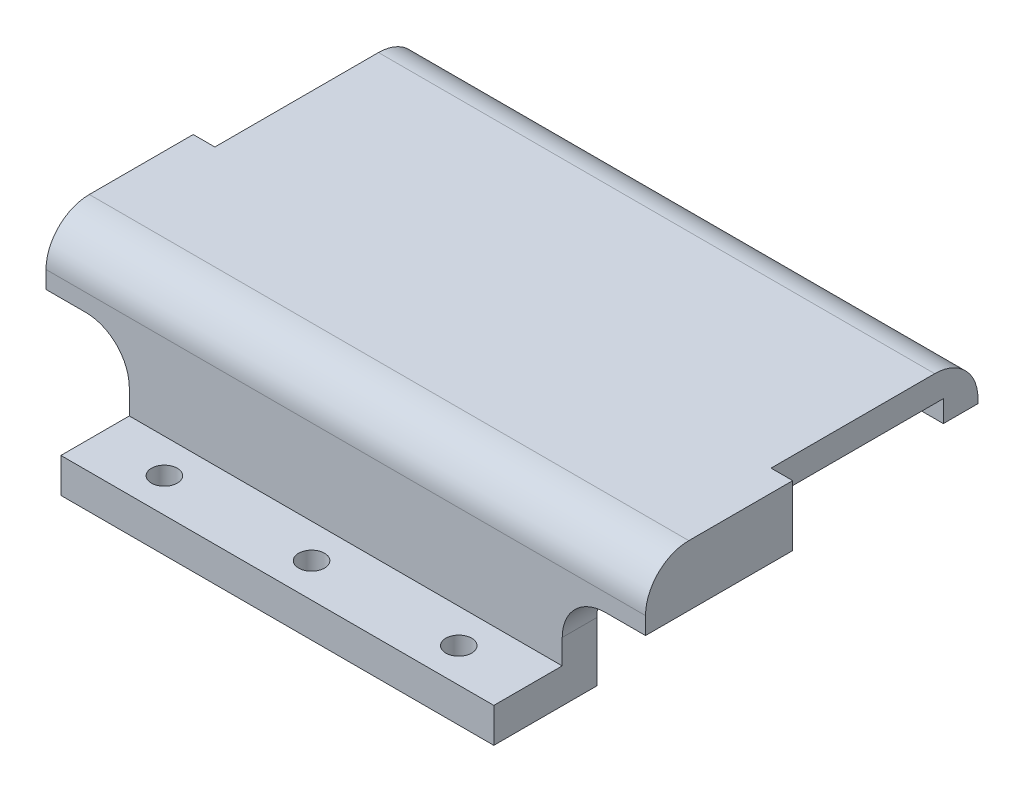
ISO-10303-21;
HEADER;
FILE_DESCRIPTION(('STEP AP214'),'2;1');
FILE_NAME('part.step','',(''),(''),'','','');
FILE_SCHEMA(('AUTOMOTIVE_DESIGN { 1 0 10303 214 1 1 1 1 }'));
ENDSEC;
DATA;
#1=APPLICATION_CONTEXT('core data for automotive mechanical design processes');
#2=APPLICATION_PROTOCOL_DEFINITION('international standard','automotive_design',2000,#1);
#3=PRODUCT_CONTEXT('',#1,'mechanical');
#4=PRODUCT('Part','Part','',(#3));
#5=PRODUCT_RELATED_PRODUCT_CATEGORY('part','',(#4));
#6=PRODUCT_DEFINITION_FORMATION('','',#4);
#7=PRODUCT_DEFINITION_CONTEXT('part definition',#1,'design');
#8=PRODUCT_DEFINITION('design','',#6,#7);
#9=PRODUCT_DEFINITION_SHAPE('','',#8);
#10=(LENGTH_UNIT() NAMED_UNIT(*) SI_UNIT(.MILLI.,.METRE.));
#11=(NAMED_UNIT(*) PLANE_ANGLE_UNIT() SI_UNIT($,.RADIAN.));
#12=(NAMED_UNIT(*) SI_UNIT($,.STERADIAN.) SOLID_ANGLE_UNIT());
#13=UNCERTAINTY_MEASURE_WITH_UNIT(LENGTH_MEASURE(1.E-05),#10,'distance_accuracy_value','');
#14=(GEOMETRIC_REPRESENTATION_CONTEXT(3) GLOBAL_UNCERTAINTY_ASSIGNED_CONTEXT((#13)) GLOBAL_UNIT_ASSIGNED_CONTEXT((#10,
#11,#12)) REPRESENTATION_CONTEXT('',''));
#15=CARTESIAN_POINT('',(0.,0.,0.));
#16=DIRECTION('',(0.,0.,1.));
#17=DIRECTION('',(1.,0.,0.));
#18=AXIS2_PLACEMENT_3D('',#15,#16,#17);
#19=CARTESIAN_POINT('',(-31.75,-15.0368,36.0045));
#20=DIRECTION('',(0.,-1.,0.));
#21=DIRECTION('',(0.,0.,-1.));
#22=AXIS2_PLACEMENT_3D('',#19,#20,#21);
#23=PLANE('',#22);
#24=CARTESIAN_POINT('',(-21.59,-15.0368,30.988));
#25=DIRECTION('',(0.,1.,0.));
#26=DIRECTION('',(0.,0.,1.));
#27=AXIS2_PLACEMENT_3D('',#24,#25,#26);
#28=CIRCLE('',#27,1.89865);
#29=CARTESIAN_POINT('',(-21.59,-15.0368,32.88665));
#30=VERTEX_POINT('',#29);
#31=EDGE_CURVE('E528',#30,#30,#28,.T.);
#32=ORIENTED_EDGE('',*,*,#31,.F.);
#33=EDGE_LOOP('',(#32));
#34=FACE_BOUND('',#33,.T.);
#35=CARTESIAN_POINT('',(21.59,-15.0368,30.988));
#36=DIRECTION('',(0.,1.,0.));
#37=DIRECTION('',(0.,0.,1.));
#38=AXIS2_PLACEMENT_3D('',#35,#36,#37);
#39=CIRCLE('',#38,1.89865);
#40=CARTESIAN_POINT('',(21.59,-15.0368,32.88665));
#41=VERTEX_POINT('',#40);
#42=EDGE_CURVE('E516',#41,#41,#39,.T.);
#43=ORIENTED_EDGE('',*,*,#42,.F.);
#44=EDGE_LOOP('',(#43));
#45=FACE_BOUND('',#44,.T.);
#46=DIRECTION('',(-1.,0.,0.));
#47=VECTOR('',#46,1.);
#48=CARTESIAN_POINT('',(-31.75,-15.0368,25.9715));
#49=LINE('',#48,#47);
#50=CARTESIAN_POINT('',(31.75,-15.0368,25.9715));
#51=VERTEX_POINT('',#50);
#52=CARTESIAN_POINT('',(-31.75,-15.0368,25.9715));
#53=VERTEX_POINT('',#52);
#54=EDGE_CURVE('E360',#51,#53,#49,.T.);
#55=ORIENTED_EDGE('',*,*,#54,.T.);
#56=DIRECTION('',(0.,0.,-1.));
#57=VECTOR('',#56,1.);
#58=CARTESIAN_POINT('',(-31.75,-15.0368,36.0045));
#59=LINE('',#58,#57);
#60=CARTESIAN_POINT('',(-31.75,-15.0368,36.0045));
#61=VERTEX_POINT('',#60);
#62=EDGE_CURVE('E241',#61,#53,#59,.T.);
#63=ORIENTED_EDGE('',*,*,#62,.F.);
#64=DIRECTION('',(-1.,0.,0.));
#65=VECTOR('',#64,1.);
#66=CARTESIAN_POINT('',(-31.75,-15.0368,36.0045));
#67=LINE('',#66,#65);
#68=CARTESIAN_POINT('',(31.75,-15.0368,36.0045));
#69=VERTEX_POINT('',#68);
#70=EDGE_CURVE('E375',#69,#61,#67,.T.);
#71=ORIENTED_EDGE('',*,*,#70,.F.);
#72=DIRECTION('',(0.,0.,-1.));
#73=VECTOR('',#72,1.);
#74=CARTESIAN_POINT('',(31.75,-15.0368,36.0045));
#75=LINE('',#74,#73);
#76=EDGE_CURVE('E236',#69,#51,#75,.T.);
#77=ORIENTED_EDGE('',*,*,#76,.T.);
#78=EDGE_LOOP('',(#55,#63,#71,#77));
#79=FACE_BOUND('',#78,.T.);
#80=CARTESIAN_POINT('',(0.,-15.0368,30.988));
#81=DIRECTION('',(0.,1.,0.));
#82=DIRECTION('',(0.,0.,1.));
#83=AXIS2_PLACEMENT_3D('',#80,#81,#82);
#84=CIRCLE('',#83,1.89865);
#85=CARTESIAN_POINT('',(0.,-15.0368,32.88665));
#86=VERTEX_POINT('',#85);
#87=EDGE_CURVE('E522',#86,#86,#84,.T.);
#88=ORIENTED_EDGE('',*,*,#87,.F.);
#89=EDGE_LOOP('',(#88));
#90=FACE_BOUND('',#89,.T.);
#91=ADVANCED_FACE('F33',(#34,#45,#79,#90),#23,.F.);
#92=CARTESIAN_POINT('',(0.,0.,0.));
#93=DIRECTION('',(0.,-1.,0.));
#94=DIRECTION('',(0.,0.,-1.));
#95=AXIS2_PLACEMENT_3D('',#92,#93,#94);
#96=PLANE('',#95);
#97=DIRECTION('',(1.,0.,0.));
#98=VECTOR('',#97,1.);
#99=CARTESIAN_POINT('',(-31.75,0.,20.8915));
#100=LINE('',#99,#98);
#101=CARTESIAN_POINT('',(0.634999999999997,0.,20.8915));
#102=VERTEX_POINT('',#101);
#103=CARTESIAN_POINT('',(40.7924,0.,20.8915));
#104=VERTEX_POINT('',#103);
#105=EDGE_CURVE('E252',#102,#104,#100,.T.);
#106=ORIENTED_EDGE('',*,*,#105,.F.);
#107=DIRECTION('',(0.,0.,1.));
#108=VECTOR('',#107,1.);
#109=CARTESIAN_POINT('',(0.634999999999997,0.,20.8915));
#110=LINE('',#109,#108);
#111=CARTESIAN_POINT('',(0.635000000000005,0.,-20.8915));
#112=VERTEX_POINT('',#111);
#113=EDGE_CURVE('E217',#112,#102,#110,.T.);
#114=ORIENTED_EDGE('',*,*,#113,.F.);
#115=DIRECTION('',(-1.,0.,0.));
#116=VECTOR('',#115,1.);
#117=CARTESIAN_POINT('',(-40.7924,0.,-20.8915));
#118=LINE('',#117,#116);
#119=CARTESIAN_POINT('',(40.7924,0.,-20.8915));
#120=VERTEX_POINT('',#119);
#121=EDGE_CURVE('E235',#120,#112,#118,.T.);
#122=ORIENTED_EDGE('',*,*,#121,.F.);
#123=DIRECTION('',(0.,0.,-1.));
#124=VECTOR('',#123,1.);
#125=CARTESIAN_POINT('',(40.7924,0.,25.9715));
#126=LINE('',#125,#124);
#127=CARTESIAN_POINT('',(40.7924,0.,4.38149999999999));
#128=VERTEX_POINT('',#127);
#129=EDGE_CURVE('E274',#128,#120,#126,.T.);
#130=ORIENTED_EDGE('',*,*,#129,.F.);
#131=EDGE_CURVE('E281',#104,#128,#126,.T.);
#132=ORIENTED_EDGE('',*,*,#131,.F.);
#133=EDGE_LOOP('',(#106,#114,#122,#130,#132));
#134=FACE_BOUND('',#133,.T.);
#135=ADVANCED_FACE('F536',(#134),#96,.T.);
#136=CARTESIAN_POINT('',(-0.634999999999995,0.,-20.8915));
#137=VERTEX_POINT('',#136);
#138=CARTESIAN_POINT('',(-40.7924,0.,-20.8915));
#139=VERTEX_POINT('',#138);
#140=EDGE_CURVE('E224',#137,#139,#118,.T.);
#141=ORIENTED_EDGE('',*,*,#140,.F.);
#142=DIRECTION('',(0.,0.,-1.));
#143=VECTOR('',#142,1.);
#144=CARTESIAN_POINT('',(-0.634999999999997,0.,20.8915));
#145=LINE('',#144,#143);
#146=CARTESIAN_POINT('',(-0.634999999999997,0.,20.8915));
#147=VERTEX_POINT('',#146);
#148=EDGE_CURVE('E210',#147,#137,#145,.T.);
#149=ORIENTED_EDGE('',*,*,#148,.F.);
#150=CARTESIAN_POINT('',(-40.7924,0.,20.8915));
#151=VERTEX_POINT('',#150);
#152=EDGE_CURVE('E257',#151,#147,#100,.T.);
#153=ORIENTED_EDGE('',*,*,#152,.F.);
#154=DIRECTION('',(0.,0.,1.));
#155=VECTOR('',#154,1.);
#156=CARTESIAN_POINT('',(-40.7924,0.,25.9715));
#157=LINE('',#156,#155);
#158=CARTESIAN_POINT('',(-40.7924,0.,4.3815));
#159=VERTEX_POINT('',#158);
#160=EDGE_CURVE('E283',#159,#151,#157,.T.);
#161=ORIENTED_EDGE('',*,*,#160,.F.);
#162=EDGE_CURVE('E234',#139,#159,#157,.T.);
#163=ORIENTED_EDGE('',*,*,#162,.F.);
#164=EDGE_LOOP('',(#141,#149,#153,#161,#163));
#165=FACE_BOUND('',#164,.T.);
#166=ADVANCED_FACE('F231',(#165),#96,.T.);
#167=CARTESIAN_POINT('',(-31.75,-20.1168,20.8915));
#168=DIRECTION('',(0.,0.,1.));
#169=DIRECTION('',(1.,0.,0.));
#170=AXIS2_PLACEMENT_3D('',#167,#168,#169);
#171=PLANE('',#170);
#172=DIRECTION('',(0.,1.,0.));
#173=VECTOR('',#172,1.);
#174=CARTESIAN_POINT('',(0.634999999999997,-44.9772964560561,20.8915));
#175=LINE('',#174,#173);
#176=CARTESIAN_POINT('',(0.634999999999997,-3.17500000000001,20.8915));
#177=VERTEX_POINT('',#176);
#178=EDGE_CURVE('E400',#177,#102,#175,.T.);
#179=ORIENTED_EDGE('',*,*,#178,.T.);
#180=ORIENTED_EDGE('',*,*,#105,.T.);
#181=DIRECTION('',(0.,-1.,0.));
#182=VECTOR('',#181,1.);
#183=CARTESIAN_POINT('',(40.7924,-5.08,20.8915));
#184=LINE('',#183,#182);
#185=CARTESIAN_POINT('',(40.7924,-5.08,20.8915));
#186=VERTEX_POINT('',#185);
#187=EDGE_CURVE('E417',#104,#186,#184,.T.);
#188=ORIENTED_EDGE('',*,*,#187,.T.);
#189=DIRECTION('',(-1.,0.,0.));
#190=VECTOR('',#189,1.);
#191=CARTESIAN_POINT('',(40.7924,-5.08,20.8915));
#192=LINE('',#191,#190);
#193=CARTESIAN_POINT('',(38.1,-5.08,20.8915));
#194=VERTEX_POINT('',#193);
#195=EDGE_CURVE('E414',#186,#194,#192,.T.);
#196=ORIENTED_EDGE('',*,*,#195,.T.);
#197=CARTESIAN_POINT('',(38.1,-11.43,20.8915));
#198=DIRECTION('',(0.,0.,1.));
#199=DIRECTION('',(1.,0.,0.));
#200=AXIS2_PLACEMENT_3D('',#197,#198,#199);
#201=CIRCLE('',#200,6.35);
#202=CARTESIAN_POINT('',(31.75,-11.43,20.8915));
#203=VERTEX_POINT('',#202);
#204=EDGE_CURVE('E311',#194,#203,#201,.T.);
#205=ORIENTED_EDGE('',*,*,#204,.T.);
#206=DIRECTION('',(0.,1.,0.));
#207=VECTOR('',#206,1.);
#208=CARTESIAN_POINT('',(31.75,-20.1168,20.8915));
#209=LINE('',#208,#207);
#210=CARTESIAN_POINT('',(31.75,-20.1168,20.8915));
#211=VERTEX_POINT('',#210);
#212=EDGE_CURVE('E268',#211,#203,#209,.T.);
#213=ORIENTED_EDGE('',*,*,#212,.F.);
#214=DIRECTION('',(1.,0.,0.));
#215=VECTOR('',#214,1.);
#216=CARTESIAN_POINT('',(-31.75,-20.1168,20.8915));
#217=LINE('',#216,#215);
#218=CARTESIAN_POINT('',(-31.75,-20.1168,20.8915));
#219=VERTEX_POINT('',#218);
#220=EDGE_CURVE('E256',#219,#211,#217,.T.);
#221=ORIENTED_EDGE('',*,*,#220,.F.);
#222=DIRECTION('',(0.,1.,0.));
#223=VECTOR('',#222,1.);
#224=CARTESIAN_POINT('',(-31.75,-20.1168,20.8915));
#225=LINE('',#224,#223);
#226=CARTESIAN_POINT('',(-31.75,-11.43,20.8915));
#227=VERTEX_POINT('',#226);
#228=EDGE_CURVE('E271',#219,#227,#225,.T.);
#229=ORIENTED_EDGE('',*,*,#228,.T.);
#230=CARTESIAN_POINT('',(-38.1,-11.43,20.8915));
#231=DIRECTION('',(0.,0.,1.));
#232=DIRECTION('',(1.,0.,0.));
#233=AXIS2_PLACEMENT_3D('',#230,#231,#232);
#234=CIRCLE('',#233,6.35);
#235=CARTESIAN_POINT('',(-38.1,-5.08,20.8915));
#236=VERTEX_POINT('',#235);
#237=EDGE_CURVE('E315',#227,#236,#234,.T.);
#238=ORIENTED_EDGE('',*,*,#237,.T.);
#239=DIRECTION('',(-1.,0.,0.));
#240=VECTOR('',#239,1.);
#241=CARTESIAN_POINT('',(-40.7924,-5.08,20.8915));
#242=LINE('',#241,#240);
#243=CARTESIAN_POINT('',(-40.7924,-5.08,20.8915));
#244=VERTEX_POINT('',#243);
#245=EDGE_CURVE('E411',#236,#244,#242,.T.);
#246=ORIENTED_EDGE('',*,*,#245,.T.);
#247=DIRECTION('',(0.,1.,0.));
#248=VECTOR('',#247,1.);
#249=CARTESIAN_POINT('',(-40.7924,-5.08,20.8915));
#250=LINE('',#249,#248);
#251=EDGE_CURVE('E408',#244,#151,#250,.T.);
#252=ORIENTED_EDGE('',*,*,#251,.T.);
#253=ORIENTED_EDGE('',*,*,#152,.T.);
#254=DIRECTION('',(0.,1.,0.));
#255=VECTOR('',#254,1.);
#256=CARTESIAN_POINT('',(-0.634999999999997,-44.9772964560561,20.8915));
#257=LINE('',#256,#255);
#258=CARTESIAN_POINT('',(-0.634999999999997,-3.175,20.8915));
#259=VERTEX_POINT('',#258);
#260=EDGE_CURVE('E213',#259,#147,#257,.T.);
#261=ORIENTED_EDGE('',*,*,#260,.F.);
#262=DIRECTION('',(1.,0.,0.));
#263=VECTOR('',#262,1.);
#264=CARTESIAN_POINT('',(-0.634999999999997,-3.175,20.8915));
#265=LINE('',#264,#263);
#266=EDGE_CURVE('E227',#259,#177,#265,.T.);
#267=ORIENTED_EDGE('',*,*,#266,.T.);
#268=EDGE_LOOP('',(#179,#180,#188,#196,#205,#213,#221,#229,#238,#246,#252,#253,#261,#267));
#269=FACE_BOUND('',#268,.T.);
#270=ADVANCED_FACE('F454',(#269),#171,.F.);
#271=CARTESIAN_POINT('',(-40.7924,-3.175,-20.8915));
#272=DIRECTION('',(0.,0.,-1.));
#273=DIRECTION('',(-1.,0.,0.));
#274=AXIS2_PLACEMENT_3D('',#271,#272,#273);
#275=PLANE('',#274);
#276=DIRECTION('',(0.,1.,0.));
#277=VECTOR('',#276,1.);
#278=CARTESIAN_POINT('',(0.635000000000005,-44.9772964560561,-20.8915));
#279=LINE('',#278,#277);
#280=CARTESIAN_POINT('',(0.635000000000005,-3.175,-20.8915));
#281=VERTEX_POINT('',#280);
#282=EDGE_CURVE('E228',#281,#112,#279,.T.);
#283=ORIENTED_EDGE('',*,*,#282,.F.);
#284=DIRECTION('',(-1.,0.,0.));
#285=VECTOR('',#284,1.);
#286=CARTESIAN_POINT('',(-40.7924,-3.175,-20.8915));
#287=LINE('',#286,#285);
#288=CARTESIAN_POINT('',(40.7924,-3.175,-20.8915));
#289=VERTEX_POINT('',#288);
#290=EDGE_CURVE('E245',#289,#281,#287,.T.);
#291=ORIENTED_EDGE('',*,*,#290,.F.);
#292=DIRECTION('',(0.,1.,0.));
#293=VECTOR('',#292,1.);
#294=CARTESIAN_POINT('',(40.7924,-3.175,-20.8915));
#295=LINE('',#294,#293);
#296=EDGE_CURVE('E249',#289,#120,#295,.T.);
#297=ORIENTED_EDGE('',*,*,#296,.T.);
#298=ORIENTED_EDGE('',*,*,#121,.T.);
#299=EDGE_LOOP('',(#283,#291,#297,#298));
#300=FACE_BOUND('',#299,.T.);
#301=ADVANCED_FACE('F396',(#300),#275,.F.);
#302=DIRECTION('',(0.,1.,0.));
#303=VECTOR('',#302,1.);
#304=CARTESIAN_POINT('',(-0.634999999999995,-44.9772964560561,-20.8915));
#305=LINE('',#304,#303);
#306=CARTESIAN_POINT('',(-0.634999999999997,-3.175,-20.8915));
#307=VERTEX_POINT('',#306);
#308=EDGE_CURVE('E48',#307,#137,#305,.T.);
#309=ORIENTED_EDGE('',*,*,#308,.T.);
#310=ORIENTED_EDGE('',*,*,#140,.T.);
#311=DIRECTION('',(0.,1.,0.));
#312=VECTOR('',#311,1.);
#313=CARTESIAN_POINT('',(-40.7924,-3.175,-20.8915));
#314=LINE('',#313,#312);
#315=CARTESIAN_POINT('',(-40.7924,-3.175,-20.8915));
#316=VERTEX_POINT('',#315);
#317=EDGE_CURVE('E247',#316,#139,#314,.T.);
#318=ORIENTED_EDGE('',*,*,#317,.F.);
#319=EDGE_CURVE('E226',#307,#316,#287,.T.);
#320=ORIENTED_EDGE('',*,*,#319,.F.);
#321=EDGE_LOOP('',(#309,#310,#318,#320));
#322=FACE_BOUND('',#321,.T.);
#323=ADVANCED_FACE('F222',(#322),#275,.F.);
#324=CARTESIAN_POINT('',(-40.7924,-5.08,25.9715));
#325=DIRECTION('',(1.,0.,0.));
#326=DIRECTION('',(0.,0.,-1.));
#327=AXIS2_PLACEMENT_3D('',#324,#325,#326);
#328=PLANE('',#327);
#329=ORIENTED_EDGE('',*,*,#160,.T.);
#330=ORIENTED_EDGE('',*,*,#251,.F.);
#331=DIRECTION('',(0.,0.,-1.));
#332=VECTOR('',#331,1.);
#333=CARTESIAN_POINT('',(-40.7924,-5.08,25.9715));
#334=LINE('',#333,#332);
#335=CARTESIAN_POINT('',(-40.7924,-5.08,4.3815));
#336=VERTEX_POINT('',#335);
#337=EDGE_CURVE('E351',#244,#336,#334,.T.);
#338=ORIENTED_EDGE('',*,*,#337,.T.);
#339=DIRECTION('',(0.,1.,0.));
#340=VECTOR('',#339,1.);
#341=CARTESIAN_POINT('',(-40.7924,-5.08,4.3815));
#342=LINE('',#341,#340);
#343=EDGE_CURVE('E363',#336,#159,#342,.T.);
#344=ORIENTED_EDGE('',*,*,#343,.T.);
#345=EDGE_LOOP('',(#329,#330,#338,#344));
#346=FACE_BOUND('',#345,.T.);
#347=ADVANCED_FACE('F508',(#346),#328,.T.);
#348=CARTESIAN_POINT('',(40.7924,-5.08,25.9715));
#349=DIRECTION('',(-1.,0.,0.));
#350=DIRECTION('',(0.,0.,1.));
#351=AXIS2_PLACEMENT_3D('',#348,#349,#350);
#352=PLANE('',#351);
#353=DIRECTION('',(0.,0.,1.));
#354=VECTOR('',#353,1.);
#355=CARTESIAN_POINT('',(40.7924,-5.08,25.9715));
#356=LINE('',#355,#354);
#357=CARTESIAN_POINT('',(40.7924,-5.08,4.38149999999999));
#358=VERTEX_POINT('',#357);
#359=EDGE_CURVE('E420',#358,#186,#356,.T.);
#360=ORIENTED_EDGE('',*,*,#359,.T.);
#361=ORIENTED_EDGE('',*,*,#187,.F.);
#362=ORIENTED_EDGE('',*,*,#131,.T.);
#363=DIRECTION('',(0.,1.,0.));
#364=VECTOR('',#363,1.);
#365=CARTESIAN_POINT('',(40.7924,-5.08,4.38149999999999));
#366=LINE('',#365,#364);
#367=EDGE_CURVE('E355',#358,#128,#366,.T.);
#368=ORIENTED_EDGE('',*,*,#367,.F.);
#369=EDGE_LOOP('',(#360,#361,#362,#368));
#370=FACE_BOUND('',#369,.T.);
#371=ADVANCED_FACE('F564',(#370),#352,.T.);
#372=CARTESIAN_POINT('',(40.7924,3.81,25.9715));
#373=DIRECTION('',(-1.,0.,0.));
#374=DIRECTION('',(0.,0.,1.));
#375=AXIS2_PLACEMENT_3D('',#372,#373,#374);
#376=PLANE('',#375);
#377=DIRECTION('',(0.,-1.,0.));
#378=VECTOR('',#377,1.);
#379=CARTESIAN_POINT('',(40.7924,3.81,-25.9715));
#380=LINE('',#379,#378);
#381=CARTESIAN_POINT('',(40.7924,-2.54,-25.9715));
#382=VERTEX_POINT('',#381);
#383=CARTESIAN_POINT('',(40.7924,-3.175,-25.9715));
#384=VERTEX_POINT('',#383);
#385=EDGE_CURVE('E286',#382,#384,#380,.T.);
#386=ORIENTED_EDGE('',*,*,#385,.F.);
#387=CARTESIAN_POINT('',(40.7924,-2.54,-19.6215));
#388=DIRECTION('',(-1.,0.,0.));
#389=DIRECTION('',(0.,0.,1.));
#390=AXIS2_PLACEMENT_3D('',#387,#388,#389);
#391=CIRCLE('',#390,6.35);
#392=CARTESIAN_POINT('',(40.7924,3.81,-19.6215));
#393=VERTEX_POINT('',#392);
#394=EDGE_CURVE('E297',#382,#393,#391,.F.);
#395=ORIENTED_EDGE('',*,*,#394,.T.);
#396=DIRECTION('',(0.,0.,-1.));
#397=VECTOR('',#396,1.);
#398=CARTESIAN_POINT('',(40.7924,3.81,25.9715));
#399=LINE('',#398,#397);
#400=CARTESIAN_POINT('',(40.7924,3.81,4.38149999999999));
#401=VERTEX_POINT('',#400);
#402=EDGE_CURVE('E275',#401,#393,#399,.T.);
#403=ORIENTED_EDGE('',*,*,#402,.F.);
#404=EDGE_CURVE('E293',#128,#401,#366,.T.);
#405=ORIENTED_EDGE('',*,*,#404,.F.);
#406=ORIENTED_EDGE('',*,*,#129,.T.);
#407=ORIENTED_EDGE('',*,*,#296,.F.);
#408=DIRECTION('',(0.,0.,1.));
#409=VECTOR('',#408,1.);
#410=CARTESIAN_POINT('',(40.7924,-3.175,-25.9715));
#411=LINE('',#410,#409);
#412=EDGE_CURVE('E385',#384,#289,#411,.T.);
#413=ORIENTED_EDGE('',*,*,#412,.F.);
#414=EDGE_LOOP('',(#386,#395,#403,#405,#406,#407,#413));
#415=FACE_BOUND('',#414,.T.);
#416=ADVANCED_FACE('F567',(#415),#376,.F.);
#417=CARTESIAN_POINT('',(-40.7924,3.81,25.9715));
#418=DIRECTION('',(0.,0.,-1.));
#419=DIRECTION('',(-1.,0.,0.));
#420=AXIS2_PLACEMENT_3D('',#417,#418,#419);
#421=PLANE('',#420);
#422=DIRECTION('',(0.,1.,0.));
#423=VECTOR('',#422,1.);
#424=CARTESIAN_POINT('',(43.9674,-5.08,25.9715));
#425=LINE('',#424,#423);
#426=CARTESIAN_POINT('',(43.9674,-5.08,25.9715));
#427=VERTEX_POINT('',#426);
#428=CARTESIAN_POINT('',(43.9674,-2.54,25.9715));
#429=VERTEX_POINT('',#428);
#430=EDGE_CURVE('E326',#427,#429,#425,.T.);
#431=ORIENTED_EDGE('',*,*,#430,.T.);
#432=DIRECTION('',(1.,0.,0.));
#433=VECTOR('',#432,1.);
#434=CARTESIAN_POINT('',(-40.7924,-2.54,25.9715));
#435=LINE('',#434,#433);
#436=CARTESIAN_POINT('',(-43.9674,-2.54,25.9715));
#437=VERTEX_POINT('',#436);
#438=EDGE_CURVE('E41',#429,#437,#435,.F.);
#439=ORIENTED_EDGE('',*,*,#438,.T.);
#440=DIRECTION('',(0.,1.,0.));
#441=VECTOR('',#440,1.);
#442=CARTESIAN_POINT('',(-43.9674,-5.08,25.9715));
#443=LINE('',#442,#441);
#444=CARTESIAN_POINT('',(-43.9674,-5.08,25.9715));
#445=VERTEX_POINT('',#444);
#446=EDGE_CURVE('E346',#445,#437,#443,.T.);
#447=ORIENTED_EDGE('',*,*,#446,.F.);
#448=DIRECTION('',(1.,0.,0.));
#449=VECTOR('',#448,1.);
#450=CARTESIAN_POINT('',(-40.7924,-5.08,25.9715));
#451=LINE('',#450,#449);
#452=CARTESIAN_POINT('',(-38.1,-5.08,25.9715));
#453=VERTEX_POINT('',#452);
#454=EDGE_CURVE('E366',#445,#453,#451,.T.);
#455=ORIENTED_EDGE('',*,*,#454,.T.);
#456=CARTESIAN_POINT('',(-38.1,-11.43,25.9715));
#457=DIRECTION('',(0.,0.,-1.));
#458=DIRECTION('',(-1.,0.,0.));
#459=AXIS2_PLACEMENT_3D('',#456,#457,#458);
#460=CIRCLE('',#459,6.35);
#461=CARTESIAN_POINT('',(-31.75,-11.43,25.9715));
#462=VERTEX_POINT('',#461);
#463=EDGE_CURVE('E313',#453,#462,#460,.T.);
#464=ORIENTED_EDGE('',*,*,#463,.T.);
#465=DIRECTION('',(0.,1.,0.));
#466=VECTOR('',#465,1.);
#467=CARTESIAN_POINT('',(-31.75,-20.1168,25.9715));
#468=LINE('',#467,#466);
#469=EDGE_CURVE('E261',#53,#462,#468,.T.);
#470=ORIENTED_EDGE('',*,*,#469,.F.);
#471=ORIENTED_EDGE('',*,*,#54,.F.);
#472=DIRECTION('',(0.,1.,0.));
#473=VECTOR('',#472,1.);
#474=CARTESIAN_POINT('',(31.75,-20.1168,25.9715));
#475=LINE('',#474,#473);
#476=CARTESIAN_POINT('',(31.75,-11.43,25.9715));
#477=VERTEX_POINT('',#476);
#478=EDGE_CURVE('E265',#51,#477,#475,.T.);
#479=ORIENTED_EDGE('',*,*,#478,.T.);
#480=CARTESIAN_POINT('',(38.1,-11.43,25.9715));
#481=DIRECTION('',(0.,0.,-1.));
#482=DIRECTION('',(-1.,0.,0.));
#483=AXIS2_PLACEMENT_3D('',#480,#481,#482);
#484=CIRCLE('',#483,6.35);
#485=CARTESIAN_POINT('',(38.1,-5.08,25.9715));
#486=VERTEX_POINT('',#485);
#487=EDGE_CURVE('E309',#477,#486,#484,.T.);
#488=ORIENTED_EDGE('',*,*,#487,.T.);
#489=DIRECTION('',(1.,0.,0.));
#490=VECTOR('',#489,1.);
#491=CARTESIAN_POINT('',(40.7924,-5.08,25.9715));
#492=LINE('',#491,#490);
#493=EDGE_CURVE('E334',#486,#427,#492,.T.);
#494=ORIENTED_EDGE('',*,*,#493,.T.);
#495=EDGE_LOOP('',(#431,#439,#447,#455,#464,#470,#471,#479,#488,#494));
#496=FACE_BOUND('',#495,.T.);
#497=ADVANCED_FACE('F332',(#496),#421,.F.);
#498=CARTESIAN_POINT('',(-40.7924,3.81,-25.9715));
#499=DIRECTION('',(0.,0.,1.));
#500=DIRECTION('',(1.,0.,0.));
#501=AXIS2_PLACEMENT_3D('',#498,#499,#500);
#502=PLANE('',#501);
#503=DIRECTION('',(0.,-1.,0.));
#504=VECTOR('',#503,1.);
#505=CARTESIAN_POINT('',(-40.7924,3.81,-25.9715));
#506=LINE('',#505,#504);
#507=CARTESIAN_POINT('',(-40.7924,-2.54,-25.9715));
#508=VERTEX_POINT('',#507);
#509=CARTESIAN_POINT('',(-40.7924,-3.175,-25.9715));
#510=VERTEX_POINT('',#509);
#511=EDGE_CURVE('E280',#508,#510,#506,.T.);
#512=ORIENTED_EDGE('',*,*,#511,.F.);
#513=DIRECTION('',(-1.,0.,0.));
#514=VECTOR('',#513,1.);
#515=CARTESIAN_POINT('',(-40.7924,-2.54,-25.9715));
#516=LINE('',#515,#514);
#517=EDGE_CURVE('E295',#508,#382,#516,.F.);
#518=ORIENTED_EDGE('',*,*,#517,.T.);
#519=ORIENTED_EDGE('',*,*,#385,.T.);
#520=DIRECTION('',(1.,0.,0.));
#521=VECTOR('',#520,1.);
#522=CARTESIAN_POINT('',(-40.7924,-3.175,-25.9715));
#523=LINE('',#522,#521);
#524=EDGE_CURVE('E383',#510,#384,#523,.T.);
#525=ORIENTED_EDGE('',*,*,#524,.F.);
#526=EDGE_LOOP('',(#512,#518,#519,#525));
#527=FACE_BOUND('',#526,.T.);
#528=ADVANCED_FACE('F501',(#527),#502,.F.);
#529=CARTESIAN_POINT('',(-40.7924,3.81,25.9715));
#530=DIRECTION('',(1.,0.,0.));
#531=DIRECTION('',(0.,0.,-1.));
#532=AXIS2_PLACEMENT_3D('',#529,#530,#531);
#533=PLANE('',#532);
#534=DIRECTION('',(0.,0.,1.));
#535=VECTOR('',#534,1.);
#536=CARTESIAN_POINT('',(-40.7924,3.81,25.9715));
#537=LINE('',#536,#535);
#538=CARTESIAN_POINT('',(-40.7924,3.81,-19.6215));
#539=VERTEX_POINT('',#538);
#540=CARTESIAN_POINT('',(-40.7924,3.81,4.3815));
#541=VERTEX_POINT('',#540);
#542=EDGE_CURVE('E278',#539,#541,#537,.T.);
#543=ORIENTED_EDGE('',*,*,#542,.F.);
#544=CARTESIAN_POINT('',(-40.7924,-2.54,-19.6215));
#545=DIRECTION('',(1.,0.,0.));
#546=DIRECTION('',(0.,0.,-1.));
#547=AXIS2_PLACEMENT_3D('',#544,#545,#546);
#548=CIRCLE('',#547,6.35);
#549=EDGE_CURVE('E292',#539,#508,#548,.F.);
#550=ORIENTED_EDGE('',*,*,#549,.T.);
#551=ORIENTED_EDGE('',*,*,#511,.T.);
#552=DIRECTION('',(0.,0.,-1.));
#553=VECTOR('',#552,1.);
#554=CARTESIAN_POINT('',(-40.7924,-3.175,-25.9715));
#555=LINE('',#554,#553);
#556=EDGE_CURVE('E239',#316,#510,#555,.T.);
#557=ORIENTED_EDGE('',*,*,#556,.F.);
#558=ORIENTED_EDGE('',*,*,#317,.T.);
#559=ORIENTED_EDGE('',*,*,#162,.T.);
#560=EDGE_CURVE('E288',#159,#541,#342,.T.);
#561=ORIENTED_EDGE('',*,*,#560,.T.);
#562=EDGE_LOOP('',(#543,#550,#551,#557,#558,#559,#561));
#563=FACE_BOUND('',#562,.T.);
#564=ADVANCED_FACE('F496',(#563),#533,.F.);
#565=CARTESIAN_POINT('',(0.,3.81,0.));
#566=DIRECTION('',(0.,-1.,0.));
#567=DIRECTION('',(0.,0.,-1.));
#568=AXIS2_PLACEMENT_3D('',#565,#566,#567);
#569=PLANE('',#568);
#570=DIRECTION('',(0.,0.,1.));
#571=VECTOR('',#570,1.);
#572=CARTESIAN_POINT('',(-43.9674,3.81,25.9715));
#573=LINE('',#572,#571);
#574=CARTESIAN_POINT('',(-43.9674,3.81,4.3815));
#575=VERTEX_POINT('',#574);
#576=CARTESIAN_POINT('',(-43.9674,3.81,19.6215));
#577=VERTEX_POINT('',#576);
#578=EDGE_CURVE('E343',#575,#577,#573,.T.);
#579=ORIENTED_EDGE('',*,*,#578,.T.);
#580=DIRECTION('',(1.,0.,0.));
#581=VECTOR('',#580,1.);
#582=CARTESIAN_POINT('',(0.,3.81,19.6215));
#583=LINE('',#582,#581);
#584=CARTESIAN_POINT('',(43.9674,3.81,19.6215));
#585=VERTEX_POINT('',#584);
#586=EDGE_CURVE('E317',#577,#585,#583,.T.);
#587=ORIENTED_EDGE('',*,*,#586,.T.);
#588=DIRECTION('',(0.,0.,-1.));
#589=VECTOR('',#588,1.);
#590=CARTESIAN_POINT('',(43.9674,3.81,25.9715));
#591=LINE('',#590,#589);
#592=CARTESIAN_POINT('',(43.9674,3.81,4.38149999999999));
#593=VERTEX_POINT('',#592);
#594=EDGE_CURVE('E329',#585,#593,#591,.T.);
#595=ORIENTED_EDGE('',*,*,#594,.T.);
#596=DIRECTION('',(-1.,0.,0.));
#597=VECTOR('',#596,1.);
#598=CARTESIAN_POINT('',(40.7924,3.81,4.38149999999999));
#599=LINE('',#598,#597);
#600=EDGE_CURVE('E422',#593,#401,#599,.T.);
#601=ORIENTED_EDGE('',*,*,#600,.T.);
#602=ORIENTED_EDGE('',*,*,#402,.T.);
#603=DIRECTION('',(-1.,0.,0.));
#604=VECTOR('',#603,1.);
#605=CARTESIAN_POINT('',(0.,3.81,-19.6215));
#606=LINE('',#605,#604);
#607=EDGE_CURVE('E289',#393,#539,#606,.T.);
#608=ORIENTED_EDGE('',*,*,#607,.T.);
#609=ORIENTED_EDGE('',*,*,#542,.T.);
#610=DIRECTION('',(-1.,0.,0.));
#611=VECTOR('',#610,1.);
#612=CARTESIAN_POINT('',(-40.7924,3.81,4.3815));
#613=LINE('',#612,#611);
#614=EDGE_CURVE('E350',#541,#575,#613,.T.);
#615=ORIENTED_EDGE('',*,*,#614,.T.);
#616=EDGE_LOOP('',(#579,#587,#595,#601,#602,#608,#609,#615));
#617=FACE_BOUND('',#616,.T.);
#618=ADVANCED_FACE('F348',(#617),#569,.F.);
#619=CARTESIAN_POINT('',(-31.75,-20.1168,25.9715));
#620=DIRECTION('',(1.,0.,0.));
#621=DIRECTION('',(0.,0.,-1.));
#622=AXIS2_PLACEMENT_3D('',#619,#620,#621);
#623=PLANE('',#622);
#624=ORIENTED_EDGE('',*,*,#469,.T.);
#625=DIRECTION('',(0.,0.,1.));
#626=VECTOR('',#625,1.);
#627=CARTESIAN_POINT('',(-31.75,-11.43,20.8915));
#628=LINE('',#627,#626);
#629=EDGE_CURVE('E307',#462,#227,#628,.F.);
#630=ORIENTED_EDGE('',*,*,#629,.T.);
#631=ORIENTED_EDGE('',*,*,#228,.F.);
#632=DIRECTION('',(0.,0.,-1.));
#633=VECTOR('',#632,1.);
#634=CARTESIAN_POINT('',(-31.75,-20.1168,25.9715));
#635=LINE('',#634,#633);
#636=CARTESIAN_POINT('',(-31.75,-20.1168,36.0045));
#637=VERTEX_POINT('',#636);
#638=EDGE_CURVE('E253',#637,#219,#635,.T.);
#639=ORIENTED_EDGE('',*,*,#638,.F.);
#640=DIRECTION('',(0.,-1.,0.));
#641=VECTOR('',#640,1.);
#642=CARTESIAN_POINT('',(-31.75,-20.1168,36.0045));
#643=LINE('',#642,#641);
#644=EDGE_CURVE('E367',#61,#637,#643,.T.);
#645=ORIENTED_EDGE('',*,*,#644,.F.);
#646=ORIENTED_EDGE('',*,*,#62,.T.);
#647=EDGE_LOOP('',(#624,#630,#631,#639,#645,#646));
#648=FACE_BOUND('',#647,.T.);
#649=ADVANCED_FACE('F452',(#648),#623,.F.);
#650=CARTESIAN_POINT('',(31.75,-20.1168,25.9715));
#651=DIRECTION('',(-1.,0.,0.));
#652=DIRECTION('',(0.,0.,1.));
#653=AXIS2_PLACEMENT_3D('',#650,#651,#652);
#654=PLANE('',#653);
#655=ORIENTED_EDGE('',*,*,#212,.T.);
#656=DIRECTION('',(0.,0.,1.));
#657=VECTOR('',#656,1.);
#658=CARTESIAN_POINT('',(31.75,-11.43,25.9715));
#659=LINE('',#658,#657);
#660=EDGE_CURVE('E299',#203,#477,#659,.T.);
#661=ORIENTED_EDGE('',*,*,#660,.T.);
#662=ORIENTED_EDGE('',*,*,#478,.F.);
#663=ORIENTED_EDGE('',*,*,#76,.F.);
#664=DIRECTION('',(0.,1.,0.));
#665=VECTOR('',#664,1.);
#666=CARTESIAN_POINT('',(31.75,-20.1168,36.0045));
#667=LINE('',#666,#665);
#668=CARTESIAN_POINT('',(31.75,-20.1168,36.0045));
#669=VERTEX_POINT('',#668);
#670=EDGE_CURVE('E373',#669,#69,#667,.T.);
#671=ORIENTED_EDGE('',*,*,#670,.F.);
#672=DIRECTION('',(0.,0.,1.));
#673=VECTOR('',#672,1.);
#674=CARTESIAN_POINT('',(31.75,-20.1168,25.9715));
#675=LINE('',#674,#673);
#676=EDGE_CURVE('E259',#211,#669,#675,.T.);
#677=ORIENTED_EDGE('',*,*,#676,.F.);
#678=EDGE_LOOP('',(#655,#661,#662,#663,#671,#677));
#679=FACE_BOUND('',#678,.T.);
#680=ADVANCED_FACE('F471',(#679),#654,.F.);
#681=CARTESIAN_POINT('',(0.,-20.1168,0.));
#682=DIRECTION('',(0.,-1.,0.));
#683=DIRECTION('',(0.,0.,-1.));
#684=AXIS2_PLACEMENT_3D('',#681,#682,#683);
#685=PLANE('',#684);
#686=CARTESIAN_POINT('',(-21.59,-20.1168,30.988));
#687=DIRECTION('',(0.,1.,0.));
#688=DIRECTION('',(0.,0.,1.));
#689=AXIS2_PLACEMENT_3D('',#686,#687,#688);
#690=CIRCLE('',#689,1.89865);
#691=CARTESIAN_POINT('',(-21.59,-20.1168,32.88665));
#692=VERTEX_POINT('',#691);
#693=EDGE_CURVE('E525',#692,#692,#690,.T.);
#694=ORIENTED_EDGE('',*,*,#693,.T.);
#695=EDGE_LOOP('',(#694));
#696=FACE_BOUND('',#695,.T.);
#697=CARTESIAN_POINT('',(0.,-20.1168,30.988));
#698=DIRECTION('',(0.,1.,0.));
#699=DIRECTION('',(0.,0.,1.));
#700=AXIS2_PLACEMENT_3D('',#697,#698,#699);
#701=CIRCLE('',#700,1.89865);
#702=CARTESIAN_POINT('',(0.,-20.1168,32.88665));
#703=VERTEX_POINT('',#702);
#704=EDGE_CURVE('E519',#703,#703,#701,.T.);
#705=ORIENTED_EDGE('',*,*,#704,.T.);
#706=EDGE_LOOP('',(#705));
#707=FACE_BOUND('',#706,.T.);
#708=CARTESIAN_POINT('',(21.59,-20.1168,30.988));
#709=DIRECTION('',(0.,1.,0.));
#710=DIRECTION('',(0.,0.,1.));
#711=AXIS2_PLACEMENT_3D('',#708,#709,#710);
#712=CIRCLE('',#711,1.89865);
#713=CARTESIAN_POINT('',(21.59,-20.1168,32.88665));
#714=VERTEX_POINT('',#713);
#715=EDGE_CURVE('E218',#714,#714,#712,.T.);
#716=ORIENTED_EDGE('',*,*,#715,.T.);
#717=EDGE_LOOP('',(#716));
#718=FACE_BOUND('',#717,.T.);
#719=ORIENTED_EDGE('',*,*,#638,.T.);
#720=ORIENTED_EDGE('',*,*,#220,.T.);
#721=ORIENTED_EDGE('',*,*,#676,.T.);
#722=DIRECTION('',(1.,0.,0.));
#723=VECTOR('',#722,1.);
#724=CARTESIAN_POINT('',(-31.75,-20.1168,36.0045));
#725=LINE('',#724,#723);
#726=EDGE_CURVE('E370',#637,#669,#725,.T.);
#727=ORIENTED_EDGE('',*,*,#726,.F.);
#728=EDGE_LOOP('',(#719,#720,#721,#727));
#729=FACE_BOUND('',#728,.T.);
#730=ADVANCED_FACE('F459',(#696,#707,#718,#729),#685,.T.);
#731=CARTESIAN_POINT('',(0.,-3.175,0.));
#732=DIRECTION('',(0.,1.,0.));
#733=DIRECTION('',(0.,0.,1.));
#734=AXIS2_PLACEMENT_3D('',#731,#732,#733);
#735=PLANE('',#734);
#736=ORIENTED_EDGE('',*,*,#556,.T.);
#737=ORIENTED_EDGE('',*,*,#524,.T.);
#738=ORIENTED_EDGE('',*,*,#412,.T.);
#739=ORIENTED_EDGE('',*,*,#290,.T.);
#740=DIRECTION('',(0.,0.,-1.));
#741=VECTOR('',#740,1.);
#742=CARTESIAN_POINT('',(0.634999999999997,-3.175,20.8915));
#743=LINE('',#742,#741);
#744=EDGE_CURVE('E392',#177,#281,#743,.T.);
#745=ORIENTED_EDGE('',*,*,#744,.F.);
#746=ORIENTED_EDGE('',*,*,#266,.F.);
#747=DIRECTION('',(0.,0.,1.));
#748=VECTOR('',#747,1.);
#749=CARTESIAN_POINT('',(-0.634999999999997,-3.175,20.8915));
#750=LINE('',#749,#748);
#751=EDGE_CURVE('E412',#307,#259,#750,.T.);
#752=ORIENTED_EDGE('',*,*,#751,.F.);
#753=ORIENTED_EDGE('',*,*,#319,.T.);
#754=EDGE_LOOP('',(#736,#737,#738,#739,#745,#746,#752,#753));
#755=FACE_BOUND('',#754,.T.);
#756=ADVANCED_FACE('F391',(#755),#735,.F.);
#757=CARTESIAN_POINT('',(0.,0.,36.0045));
#758=DIRECTION('',(0.,0.,-1.));
#759=DIRECTION('',(-1.,0.,0.));
#760=AXIS2_PLACEMENT_3D('',#757,#758,#759);
#761=PLANE('',#760);
#762=ORIENTED_EDGE('',*,*,#644,.T.);
#763=ORIENTED_EDGE('',*,*,#726,.T.);
#764=ORIENTED_EDGE('',*,*,#670,.T.);
#765=ORIENTED_EDGE('',*,*,#70,.T.);
#766=EDGE_LOOP('',(#762,#763,#764,#765));
#767=FACE_BOUND('',#766,.T.);
#768=ADVANCED_FACE('F463',(#767),#761,.F.);
#769=CARTESIAN_POINT('',(-43.9674,-5.08,25.9715));
#770=DIRECTION('',(-1.,0.,0.));
#771=DIRECTION('',(0.,0.,1.));
#772=AXIS2_PLACEMENT_3D('',#769,#770,#771);
#773=PLANE('',#772);
#774=ORIENTED_EDGE('',*,*,#446,.T.);
#775=CARTESIAN_POINT('',(-43.9674,-2.54,19.6215));
#776=DIRECTION('',(-1.,0.,0.));
#777=DIRECTION('',(0.,0.,1.));
#778=AXIS2_PLACEMENT_3D('',#775,#776,#777);
#779=CIRCLE('',#778,6.35);
#780=EDGE_CURVE('E11',#437,#577,#779,.T.);
#781=ORIENTED_EDGE('',*,*,#780,.T.);
#782=ORIENTED_EDGE('',*,*,#578,.F.);
#783=DIRECTION('',(0.,1.,0.));
#784=VECTOR('',#783,1.);
#785=CARTESIAN_POINT('',(-43.9674,-5.08,4.3815));
#786=LINE('',#785,#784);
#787=CARTESIAN_POINT('',(-43.9674,-5.08,4.3815));
#788=VERTEX_POINT('',#787);
#789=EDGE_CURVE('E361',#788,#575,#786,.T.);
#790=ORIENTED_EDGE('',*,*,#789,.F.);
#791=DIRECTION('',(0.,0.,1.));
#792=VECTOR('',#791,1.);
#793=CARTESIAN_POINT('',(-43.9674,-5.08,25.9715));
#794=LINE('',#793,#792);
#795=EDGE_CURVE('E436',#788,#445,#794,.T.);
#796=ORIENTED_EDGE('',*,*,#795,.T.);
#797=EDGE_LOOP('',(#774,#781,#782,#790,#796));
#798=FACE_BOUND('',#797,.T.);
#799=ADVANCED_FACE('F342',(#798),#773,.T.);
#800=CARTESIAN_POINT('',(-40.7924,-5.08,4.3815));
#801=DIRECTION('',(0.,0.,-1.));
#802=DIRECTION('',(-1.,0.,0.));
#803=AXIS2_PLACEMENT_3D('',#800,#801,#802);
#804=PLANE('',#803);
#805=ORIENTED_EDGE('',*,*,#614,.F.);
#806=ORIENTED_EDGE('',*,*,#560,.F.);
#807=ORIENTED_EDGE('',*,*,#343,.F.);
#808=DIRECTION('',(-1.,0.,0.));
#809=VECTOR('',#808,1.);
#810=CARTESIAN_POINT('',(-40.7924,-5.08,4.3815));
#811=LINE('',#810,#809);
#812=EDGE_CURVE('E353',#336,#788,#811,.T.);
#813=ORIENTED_EDGE('',*,*,#812,.T.);
#814=ORIENTED_EDGE('',*,*,#789,.T.);
#815=EDGE_LOOP('',(#805,#806,#807,#813,#814));
#816=FACE_BOUND('',#815,.T.);
#817=ADVANCED_FACE('F505',(#816),#804,.T.);
#818=CARTESIAN_POINT('',(0.,-5.08,0.));
#819=DIRECTION('',(0.,1.,0.));
#820=DIRECTION('',(0.,0.,1.));
#821=AXIS2_PLACEMENT_3D('',#818,#819,#820);
#822=PLANE('',#821);
#823=ORIENTED_EDGE('',*,*,#245,.F.);
#824=DIRECTION('',(0.,0.,1.));
#825=VECTOR('',#824,1.);
#826=CARTESIAN_POINT('',(-38.1,-5.08,25.9715));
#827=LINE('',#826,#825);
#828=EDGE_CURVE('E304',#236,#453,#827,.T.);
#829=ORIENTED_EDGE('',*,*,#828,.T.);
#830=ORIENTED_EDGE('',*,*,#454,.F.);
#831=ORIENTED_EDGE('',*,*,#795,.F.);
#832=ORIENTED_EDGE('',*,*,#812,.F.);
#833=ORIENTED_EDGE('',*,*,#337,.F.);
#834=EDGE_LOOP('',(#823,#829,#830,#831,#832,#833));
#835=FACE_BOUND('',#834,.T.);
#836=ADVANCED_FACE('F442',(#835),#822,.F.);
#837=CARTESIAN_POINT('',(40.7924,-5.08,4.38149999999999));
#838=DIRECTION('',(0.,0.,-1.));
#839=DIRECTION('',(-1.,0.,0.));
#840=AXIS2_PLACEMENT_3D('',#837,#838,#839);
#841=PLANE('',#840);
#842=ORIENTED_EDGE('',*,*,#600,.F.);
#843=DIRECTION('',(0.,1.,0.));
#844=VECTOR('',#843,1.);
#845=CARTESIAN_POINT('',(43.9674,-5.08,4.38149999999999));
#846=LINE('',#845,#844);
#847=CARTESIAN_POINT('',(43.9674,-5.08,4.38149999999999));
#848=VERTEX_POINT('',#847);
#849=EDGE_CURVE('E335',#848,#593,#846,.T.);
#850=ORIENTED_EDGE('',*,*,#849,.F.);
#851=DIRECTION('',(-1.,0.,0.));
#852=VECTOR('',#851,1.);
#853=CARTESIAN_POINT('',(40.7924,-5.08,4.38149999999999));
#854=LINE('',#853,#852);
#855=EDGE_CURVE('E336',#848,#358,#854,.T.);
#856=ORIENTED_EDGE('',*,*,#855,.T.);
#857=ORIENTED_EDGE('',*,*,#367,.T.);
#858=ORIENTED_EDGE('',*,*,#404,.T.);
#859=EDGE_LOOP('',(#842,#850,#856,#857,#858));
#860=FACE_BOUND('',#859,.T.);
#861=ADVANCED_FACE('F485',(#860),#841,.T.);
#862=CARTESIAN_POINT('',(43.9674,-5.08,25.9715));
#863=DIRECTION('',(1.,0.,0.));
#864=DIRECTION('',(0.,0.,-1.));
#865=AXIS2_PLACEMENT_3D('',#862,#863,#864);
#866=PLANE('',#865);
#867=ORIENTED_EDGE('',*,*,#594,.F.);
#868=CARTESIAN_POINT('',(43.9674,-2.54,19.6215));
#869=DIRECTION('',(1.,0.,0.));
#870=DIRECTION('',(0.,0.,-1.));
#871=AXIS2_PLACEMENT_3D('',#868,#869,#870);
#872=CIRCLE('',#871,6.35);
#873=EDGE_CURVE('E320',#585,#429,#872,.T.);
#874=ORIENTED_EDGE('',*,*,#873,.T.);
#875=ORIENTED_EDGE('',*,*,#430,.F.);
#876=DIRECTION('',(0.,0.,-1.));
#877=VECTOR('',#876,1.);
#878=CARTESIAN_POINT('',(43.9674,-5.08,25.9715));
#879=LINE('',#878,#877);
#880=EDGE_CURVE('E424',#427,#848,#879,.T.);
#881=ORIENTED_EDGE('',*,*,#880,.T.);
#882=ORIENTED_EDGE('',*,*,#849,.T.);
#883=EDGE_LOOP('',(#867,#874,#875,#881,#882));
#884=FACE_BOUND('',#883,.T.);
#885=ADVANCED_FACE('F324',(#884),#866,.T.);
#886=CARTESIAN_POINT('',(0.,-5.08,0.));
#887=DIRECTION('',(0.,-1.,0.));
#888=DIRECTION('',(0.,0.,-1.));
#889=AXIS2_PLACEMENT_3D('',#886,#887,#888);
#890=PLANE('',#889);
#891=ORIENTED_EDGE('',*,*,#493,.F.);
#892=DIRECTION('',(0.,0.,1.));
#893=VECTOR('',#892,1.);
#894=CARTESIAN_POINT('',(38.1,-5.08,0.));
#895=LINE('',#894,#893);
#896=EDGE_CURVE('E302',#486,#194,#895,.F.);
#897=ORIENTED_EDGE('',*,*,#896,.T.);
#898=ORIENTED_EDGE('',*,*,#195,.F.);
#899=ORIENTED_EDGE('',*,*,#359,.F.);
#900=ORIENTED_EDGE('',*,*,#855,.F.);
#901=ORIENTED_EDGE('',*,*,#880,.F.);
#902=EDGE_LOOP('',(#891,#897,#898,#899,#900,#901));
#903=FACE_BOUND('',#902,.T.);
#904=ADVANCED_FACE('F478',(#903),#890,.T.);
#905=CARTESIAN_POINT('',(0.,-2.54,-19.6215));
#906=DIRECTION('',(-1.,0.,0.));
#907=DIRECTION('',(0.,0.,1.));
#908=AXIS2_PLACEMENT_3D('',#905,#906,#907);
#909=CYLINDRICAL_SURFACE('',#908,6.35);
#910=ORIENTED_EDGE('',*,*,#394,.F.);
#911=ORIENTED_EDGE('',*,*,#517,.F.);
#912=ORIENTED_EDGE('',*,*,#549,.F.);
#913=ORIENTED_EDGE('',*,*,#607,.F.);
#914=EDGE_LOOP('',(#910,#911,#912,#913));
#915=FACE_BOUND('',#914,.T.);
#916=ADVANCED_FACE('F492',(#915),#909,.T.);
#917=CARTESIAN_POINT('',(38.1,-11.43,25.9715));
#918=DIRECTION('',(0.,0.,1.));
#919=DIRECTION('',(1.,0.,0.));
#920=AXIS2_PLACEMENT_3D('',#917,#918,#919);
#921=CYLINDRICAL_SURFACE('',#920,6.35);
#922=ORIENTED_EDGE('',*,*,#204,.F.);
#923=ORIENTED_EDGE('',*,*,#896,.F.);
#924=ORIENTED_EDGE('',*,*,#487,.F.);
#925=ORIENTED_EDGE('',*,*,#660,.F.);
#926=EDGE_LOOP('',(#922,#923,#924,#925));
#927=FACE_BOUND('',#926,.T.);
#928=ADVANCED_FACE('F475',(#927),#921,.F.);
#929=CARTESIAN_POINT('',(-38.1,-11.43,0.));
#930=DIRECTION('',(0.,0.,-1.));
#931=DIRECTION('',(-1.,0.,0.));
#932=AXIS2_PLACEMENT_3D('',#929,#930,#931);
#933=CYLINDRICAL_SURFACE('',#932,6.35);
#934=ORIENTED_EDGE('',*,*,#237,.F.);
#935=ORIENTED_EDGE('',*,*,#629,.F.);
#936=ORIENTED_EDGE('',*,*,#463,.F.);
#937=ORIENTED_EDGE('',*,*,#828,.F.);
#938=EDGE_LOOP('',(#934,#935,#936,#937));
#939=FACE_BOUND('',#938,.T.);
#940=ADVANCED_FACE('F448',(#939),#933,.F.);
#941=CARTESIAN_POINT('',(0.,-2.54,19.6215));
#942=DIRECTION('',(1.,0.,0.));
#943=DIRECTION('',(0.,0.,-1.));
#944=AXIS2_PLACEMENT_3D('',#941,#942,#943);
#945=CYLINDRICAL_SURFACE('',#944,6.35);
#946=ORIENTED_EDGE('',*,*,#780,.F.);
#947=ORIENTED_EDGE('',*,*,#438,.F.);
#948=ORIENTED_EDGE('',*,*,#873,.F.);
#949=ORIENTED_EDGE('',*,*,#586,.F.);
#950=EDGE_LOOP('',(#946,#947,#948,#949));
#951=FACE_BOUND('',#950,.T.);
#952=ADVANCED_FACE('F35',(#951),#945,.T.);
#953=CARTESIAN_POINT('',(0.634999999999997,-44.9772964560561,20.8915));
#954=DIRECTION('',(-1.,0.,0.));
#955=DIRECTION('',(0.,0.,1.));
#956=AXIS2_PLACEMENT_3D('',#953,#954,#955);
#957=PLANE('',#956);
#958=ORIENTED_EDGE('',*,*,#178,.F.);
#959=ORIENTED_EDGE('',*,*,#744,.T.);
#960=ORIENTED_EDGE('',*,*,#282,.T.);
#961=ORIENTED_EDGE('',*,*,#113,.T.);
#962=EDGE_LOOP('',(#958,#959,#960,#961));
#963=FACE_BOUND('',#962,.T.);
#964=ADVANCED_FACE('F551',(#963),#957,.F.);
#965=CARTESIAN_POINT('',(-0.634999999999997,-44.9772964560561,20.8915));
#966=DIRECTION('',(1.,0.,0.));
#967=DIRECTION('',(0.,0.,-1.));
#968=AXIS2_PLACEMENT_3D('',#965,#966,#967);
#969=PLANE('',#968);
#970=ORIENTED_EDGE('',*,*,#308,.F.);
#971=ORIENTED_EDGE('',*,*,#751,.T.);
#972=ORIENTED_EDGE('',*,*,#260,.T.);
#973=ORIENTED_EDGE('',*,*,#148,.T.);
#974=EDGE_LOOP('',(#970,#971,#972,#973));
#975=FACE_BOUND('',#974,.T.);
#976=ADVANCED_FACE('F211',(#975),#969,.F.);
#977=CARTESIAN_POINT('',(21.59,-15.0368,30.988));
#978=DIRECTION('',(0.,1.,0.));
#979=DIRECTION('',(0.,0.,1.));
#980=AXIS2_PLACEMENT_3D('',#977,#978,#979);
#981=CYLINDRICAL_SURFACE('',#980,1.89865);
#982=ORIENTED_EDGE('',*,*,#715,.F.);
#983=EDGE_LOOP('',(#982));
#984=FACE_BOUND('',#983,.T.);
#985=ORIENTED_EDGE('',*,*,#42,.T.);
#986=EDGE_LOOP('',(#985));
#987=FACE_BOUND('',#986,.T.);
#988=ADVANCED_FACE('F540',(#984,#987),#981,.F.);
#989=CARTESIAN_POINT('',(0.,-15.0368,30.988));
#990=DIRECTION('',(0.,1.,0.));
#991=DIRECTION('',(0.,0.,1.));
#992=AXIS2_PLACEMENT_3D('',#989,#990,#991);
#993=CYLINDRICAL_SURFACE('',#992,1.89865);
#994=ORIENTED_EDGE('',*,*,#704,.F.);
#995=EDGE_LOOP('',(#994));
#996=FACE_BOUND('',#995,.T.);
#997=ORIENTED_EDGE('',*,*,#87,.T.);
#998=EDGE_LOOP('',(#997));
#999=FACE_BOUND('',#998,.T.);
#1000=ADVANCED_FACE('F542',(#996,#999),#993,.F.);
#1001=CARTESIAN_POINT('',(-21.59,-15.0368,30.988));
#1002=DIRECTION('',(0.,1.,0.));
#1003=DIRECTION('',(0.,0.,1.));
#1004=AXIS2_PLACEMENT_3D('',#1001,#1002,#1003);
#1005=CYLINDRICAL_SURFACE('',#1004,1.89865);
#1006=ORIENTED_EDGE('',*,*,#693,.F.);
#1007=EDGE_LOOP('',(#1006));
#1008=FACE_BOUND('',#1007,.T.);
#1009=ORIENTED_EDGE('',*,*,#31,.T.);
#1010=EDGE_LOOP('',(#1009));
#1011=FACE_BOUND('',#1010,.T.);
#1012=ADVANCED_FACE('F532',(#1008,#1011),#1005,.F.);
#1013=CLOSED_SHELL('',(#91,#135,#166,#270,#301,#323,#347,#371,#416,#497,#528,#564,#618,#649,
#680,#730,#756,#768,#799,#817,#836,#861,#885,#904,#916,#928,#940,#952,#964,#976,#988,#1000,#1012));
#1014=MANIFOLD_SOLID_BREP('B2',#1013);
#1015=ADVANCED_BREP_SHAPE_REPRESENTATION('',(#18,#1014),#14);
#1016=SHAPE_DEFINITION_REPRESENTATION(#9,#1015);
ENDSEC;
END-ISO-10303-21;
